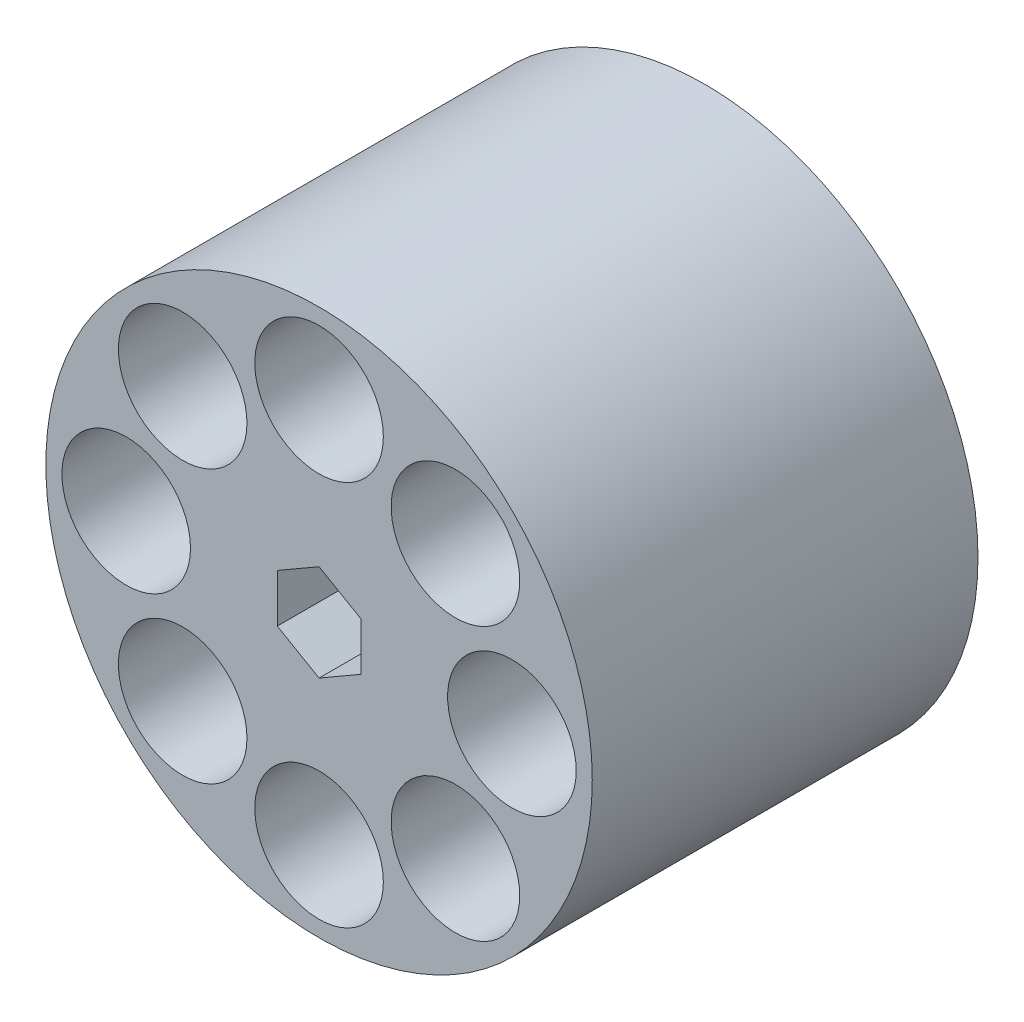
ISO-10303-21;
HEADER;
FILE_DESCRIPTION(('STEP AP214'),'2;1');
FILE_NAME('part.step','',(''),(''),'','','');
FILE_SCHEMA(('AUTOMOTIVE_DESIGN { 1 0 10303 214 1 1 1 1 }'));
ENDSEC;
DATA;
#1=APPLICATION_CONTEXT('core data for automotive mechanical design processes');
#2=APPLICATION_PROTOCOL_DEFINITION('international standard','automotive_design',2000,#1);
#3=PRODUCT_CONTEXT('',#1,'mechanical');
#4=PRODUCT('Part','Part','',(#3));
#5=PRODUCT_RELATED_PRODUCT_CATEGORY('part','',(#4));
#6=PRODUCT_DEFINITION_FORMATION('','',#4);
#7=PRODUCT_DEFINITION_CONTEXT('part definition',#1,'design');
#8=PRODUCT_DEFINITION('design','',#6,#7);
#9=PRODUCT_DEFINITION_SHAPE('','',#8);
#10=(LENGTH_UNIT() NAMED_UNIT(*) SI_UNIT(.MILLI.,.METRE.));
#11=(NAMED_UNIT(*) PLANE_ANGLE_UNIT() SI_UNIT($,.RADIAN.));
#12=(NAMED_UNIT(*) SI_UNIT($,.STERADIAN.) SOLID_ANGLE_UNIT());
#13=UNCERTAINTY_MEASURE_WITH_UNIT(LENGTH_MEASURE(1.E-05),#10,'distance_accuracy_value','');
#14=(GEOMETRIC_REPRESENTATION_CONTEXT(3) GLOBAL_UNCERTAINTY_ASSIGNED_CONTEXT((#13)) GLOBAL_UNIT_ASSIGNED_CONTEXT((#10,
#11,#12)) REPRESENTATION_CONTEXT('',''));
#15=CARTESIAN_POINT('',(0.,0.,0.));
#16=DIRECTION('',(0.,0.,1.));
#17=DIRECTION('',(1.,0.,0.));
#18=AXIS2_PLACEMENT_3D('',#15,#16,#17);
#19=CARTESIAN_POINT('',(0.,6.,-8.));
#20=DIRECTION('',(0.,0.,1.));
#21=DIRECTION('',(1.,0.,0.));
#22=AXIS2_PLACEMENT_3D('',#19,#20,#21);
#23=CYLINDRICAL_SURFACE('',#22,1.);
#24=CARTESIAN_POINT('',(0.,6.,0.));
#25=DIRECTION('',(0.,0.,1.));
#26=DIRECTION('',(1.,0.,0.));
#27=AXIS2_PLACEMENT_3D('',#24,#25,#26);
#28=CIRCLE('',#27,1.);
#29=CARTESIAN_POINT('',(1.,6.,0.));
#30=VERTEX_POINT('',#29);
#31=EDGE_CURVE('E144',#30,#30,#28,.T.);
#32=ORIENTED_EDGE('',*,*,#31,.F.);
#33=EDGE_LOOP('',(#32));
#34=FACE_BOUND('',#33,.T.);
#35=CARTESIAN_POINT('',(0.,6.,8.));
#36=DIRECTION('',(0.,0.,1.));
#37=DIRECTION('',(1.,0.,0.));
#38=AXIS2_PLACEMENT_3D('',#35,#36,#37);
#39=CIRCLE('',#38,1.);
#40=CARTESIAN_POINT('',(1.,6.,8.));
#41=VERTEX_POINT('',#40);
#42=EDGE_CURVE('E43',#41,#41,#39,.F.);
#43=ORIENTED_EDGE('',*,*,#42,.F.);
#44=EDGE_LOOP('',(#43));
#45=FACE_BOUND('',#44,.T.);
#46=ADVANCED_FACE('F39',(#34,#45),#23,.F.);
#47=CARTESIAN_POINT('',(4.24264068711929,4.24264068711928,-8.));
#48=DIRECTION('',(0.,0.,1.));
#49=DIRECTION('',(1.,0.,0.));
#50=AXIS2_PLACEMENT_3D('',#47,#48,#49);
#51=CYLINDRICAL_SURFACE('',#50,1.);
#52=CARTESIAN_POINT('',(4.24264068711929,4.24264068711928,0.));
#53=DIRECTION('',(0.,0.,1.));
#54=DIRECTION('',(1.,0.,0.));
#55=AXIS2_PLACEMENT_3D('',#52,#53,#54);
#56=CIRCLE('',#55,1.);
#57=CARTESIAN_POINT('',(5.24264068711929,4.24264068711928,0.));
#58=VERTEX_POINT('',#57);
#59=EDGE_CURVE('E155',#58,#58,#56,.T.);
#60=ORIENTED_EDGE('',*,*,#59,.F.);
#61=EDGE_LOOP('',(#60));
#62=FACE_BOUND('',#61,.T.);
#63=CARTESIAN_POINT('',(4.24264068711929,4.24264068711928,8.));
#64=DIRECTION('',(0.,0.,1.));
#65=DIRECTION('',(1.,0.,0.));
#66=AXIS2_PLACEMENT_3D('',#63,#64,#65);
#67=CIRCLE('',#66,1.);
#68=CARTESIAN_POINT('',(5.24264068711929,4.24264068711928,8.));
#69=VERTEX_POINT('',#68);
#70=EDGE_CURVE('E193',#69,#69,#67,.F.);
#71=ORIENTED_EDGE('',*,*,#70,.F.);
#72=EDGE_LOOP('',(#71));
#73=FACE_BOUND('',#72,.T.);
#74=ADVANCED_FACE('F232',(#62,#73),#51,.F.);
#75=CARTESIAN_POINT('',(6.,0.,-8.));
#76=DIRECTION('',(0.,0.,1.));
#77=DIRECTION('',(1.,0.,0.));
#78=AXIS2_PLACEMENT_3D('',#75,#76,#77);
#79=CYLINDRICAL_SURFACE('',#78,1.);
#80=CARTESIAN_POINT('',(6.,0.,0.));
#81=DIRECTION('',(0.,0.,1.));
#82=DIRECTION('',(1.,0.,0.));
#83=AXIS2_PLACEMENT_3D('',#80,#81,#82);
#84=CIRCLE('',#83,1.);
#85=CARTESIAN_POINT('',(7.,0.,0.));
#86=VERTEX_POINT('',#85);
#87=EDGE_CURVE('E158',#86,#86,#84,.T.);
#88=ORIENTED_EDGE('',*,*,#87,.F.);
#89=EDGE_LOOP('',(#88));
#90=FACE_BOUND('',#89,.T.);
#91=CARTESIAN_POINT('',(6.,0.,8.));
#92=DIRECTION('',(0.,0.,1.));
#93=DIRECTION('',(1.,0.,0.));
#94=AXIS2_PLACEMENT_3D('',#91,#92,#93);
#95=CIRCLE('',#94,1.);
#96=CARTESIAN_POINT('',(7.,0.,8.));
#97=VERTEX_POINT('',#96);
#98=EDGE_CURVE('E191',#97,#97,#95,.F.);
#99=ORIENTED_EDGE('',*,*,#98,.F.);
#100=EDGE_LOOP('',(#99));
#101=FACE_BOUND('',#100,.T.);
#102=ADVANCED_FACE('F238',(#90,#101),#79,.F.);
#103=CARTESIAN_POINT('',(4.24264068711926,-4.24264068711931,-8.));
#104=DIRECTION('',(0.,0.,1.));
#105=DIRECTION('',(1.,0.,0.));
#106=AXIS2_PLACEMENT_3D('',#103,#104,#105);
#107=CYLINDRICAL_SURFACE('',#106,1.);
#108=CARTESIAN_POINT('',(4.24264068711926,-4.24264068711931,0.));
#109=DIRECTION('',(0.,0.,1.));
#110=DIRECTION('',(1.,0.,0.));
#111=AXIS2_PLACEMENT_3D('',#108,#109,#110);
#112=CIRCLE('',#111,1.);
#113=CARTESIAN_POINT('',(5.24264068711926,-4.24264068711931,0.));
#114=VERTEX_POINT('',#113);
#115=EDGE_CURVE('E161',#114,#114,#112,.T.);
#116=ORIENTED_EDGE('',*,*,#115,.F.);
#117=EDGE_LOOP('',(#116));
#118=FACE_BOUND('',#117,.T.);
#119=CARTESIAN_POINT('',(4.24264068711926,-4.24264068711931,8.));
#120=DIRECTION('',(0.,0.,1.));
#121=DIRECTION('',(1.,0.,0.));
#122=AXIS2_PLACEMENT_3D('',#119,#120,#121);
#123=CIRCLE('',#122,1.);
#124=CARTESIAN_POINT('',(5.24264068711926,-4.24264068711931,8.));
#125=VERTEX_POINT('',#124);
#126=EDGE_CURVE('E188',#125,#125,#123,.F.);
#127=ORIENTED_EDGE('',*,*,#126,.F.);
#128=EDGE_LOOP('',(#127));
#129=FACE_BOUND('',#128,.T.);
#130=ADVANCED_FACE('F330',(#118,#129),#107,.F.);
#131=CARTESIAN_POINT('',(0.,-6.,-8.));
#132=DIRECTION('',(0.,0.,1.));
#133=DIRECTION('',(1.,0.,0.));
#134=AXIS2_PLACEMENT_3D('',#131,#132,#133);
#135=CYLINDRICAL_SURFACE('',#134,1.);
#136=CARTESIAN_POINT('',(0.,-6.,0.));
#137=DIRECTION('',(0.,0.,1.));
#138=DIRECTION('',(1.,0.,0.));
#139=AXIS2_PLACEMENT_3D('',#136,#137,#138);
#140=CIRCLE('',#139,1.);
#141=CARTESIAN_POINT('',(0.999999999999958,-6.,0.));
#142=VERTEX_POINT('',#141);
#143=EDGE_CURVE('E164',#142,#142,#140,.T.);
#144=ORIENTED_EDGE('',*,*,#143,.F.);
#145=EDGE_LOOP('',(#144));
#146=FACE_BOUND('',#145,.T.);
#147=CARTESIAN_POINT('',(0.,-6.,8.));
#148=DIRECTION('',(0.,0.,1.));
#149=DIRECTION('',(1.,0.,0.));
#150=AXIS2_PLACEMENT_3D('',#147,#148,#149);
#151=CIRCLE('',#150,1.);
#152=CARTESIAN_POINT('',(0.999999999999958,-6.,8.));
#153=VERTEX_POINT('',#152);
#154=EDGE_CURVE('E185',#153,#153,#151,.F.);
#155=ORIENTED_EDGE('',*,*,#154,.F.);
#156=EDGE_LOOP('',(#155));
#157=FACE_BOUND('',#156,.T.);
#158=ADVANCED_FACE('F334',(#146,#157),#135,.F.);
#159=CARTESIAN_POINT('',(-4.24264068711932,-4.24264068711925,-8.));
#160=DIRECTION('',(0.,0.,1.));
#161=DIRECTION('',(1.,0.,0.));
#162=AXIS2_PLACEMENT_3D('',#159,#160,#161);
#163=CYLINDRICAL_SURFACE('',#162,1.);
#164=CARTESIAN_POINT('',(-4.24264068711932,-4.24264068711925,0.));
#165=DIRECTION('',(0.,0.,1.));
#166=DIRECTION('',(1.,0.,0.));
#167=AXIS2_PLACEMENT_3D('',#164,#165,#166);
#168=CIRCLE('',#167,1.);
#169=CARTESIAN_POINT('',(-3.24264068711932,-4.24264068711925,0.));
#170=VERTEX_POINT('',#169);
#171=EDGE_CURVE('E167',#170,#170,#168,.T.);
#172=ORIENTED_EDGE('',*,*,#171,.F.);
#173=EDGE_LOOP('',(#172));
#174=FACE_BOUND('',#173,.T.);
#175=CARTESIAN_POINT('',(-4.24264068711932,-4.24264068711925,8.));
#176=DIRECTION('',(0.,0.,1.));
#177=DIRECTION('',(1.,0.,0.));
#178=AXIS2_PLACEMENT_3D('',#175,#176,#177);
#179=CIRCLE('',#178,1.);
#180=CARTESIAN_POINT('',(-3.24264068711932,-4.24264068711925,8.));
#181=VERTEX_POINT('',#180);
#182=EDGE_CURVE('E182',#181,#181,#179,.F.);
#183=ORIENTED_EDGE('',*,*,#182,.F.);
#184=EDGE_LOOP('',(#183));
#185=FACE_BOUND('',#184,.T.);
#186=ADVANCED_FACE('F282',(#174,#185),#163,.F.);
#187=CARTESIAN_POINT('',(-6.,0.,-8.));
#188=DIRECTION('',(0.,0.,1.));
#189=DIRECTION('',(1.,0.,0.));
#190=AXIS2_PLACEMENT_3D('',#187,#188,#189);
#191=CYLINDRICAL_SURFACE('',#190,1.);
#192=CARTESIAN_POINT('',(-6.,0.,0.));
#193=DIRECTION('',(0.,0.,1.));
#194=DIRECTION('',(1.,0.,0.));
#195=AXIS2_PLACEMENT_3D('',#192,#193,#194);
#196=CIRCLE('',#195,1.);
#197=CARTESIAN_POINT('',(-5.,0.,0.));
#198=VERTEX_POINT('',#197);
#199=EDGE_CURVE('E170',#198,#198,#196,.T.);
#200=ORIENTED_EDGE('',*,*,#199,.F.);
#201=EDGE_LOOP('',(#200));
#202=FACE_BOUND('',#201,.T.);
#203=CARTESIAN_POINT('',(-6.,0.,8.));
#204=DIRECTION('',(0.,0.,1.));
#205=DIRECTION('',(1.,0.,0.));
#206=AXIS2_PLACEMENT_3D('',#203,#204,#205);
#207=CIRCLE('',#206,1.);
#208=CARTESIAN_POINT('',(-5.,0.,8.));
#209=VERTEX_POINT('',#208);
#210=EDGE_CURVE('E178',#209,#209,#207,.F.);
#211=ORIENTED_EDGE('',*,*,#210,.F.);
#212=EDGE_LOOP('',(#211));
#213=FACE_BOUND('',#212,.T.);
#214=ADVANCED_FACE('F276',(#202,#213),#191,.F.);
#215=CARTESIAN_POINT('',(-4.24264068711924,4.24264068711934,-8.));
#216=DIRECTION('',(0.,0.,1.));
#217=DIRECTION('',(1.,0.,0.));
#218=AXIS2_PLACEMENT_3D('',#215,#216,#217);
#219=CYLINDRICAL_SURFACE('',#218,1.);
#220=CARTESIAN_POINT('',(-4.24264068711924,4.24264068711934,0.));
#221=DIRECTION('',(0.,0.,1.));
#222=DIRECTION('',(1.,0.,0.));
#223=AXIS2_PLACEMENT_3D('',#220,#221,#222);
#224=CIRCLE('',#223,1.);
#225=CARTESIAN_POINT('',(-3.24264068711924,4.24264068711934,0.));
#226=VERTEX_POINT('',#225);
#227=EDGE_CURVE('E152',#226,#226,#224,.T.);
#228=ORIENTED_EDGE('',*,*,#227,.F.);
#229=EDGE_LOOP('',(#228));
#230=FACE_BOUND('',#229,.T.);
#231=CARTESIAN_POINT('',(-4.24264068711924,4.24264068711934,8.));
#232=DIRECTION('',(0.,0.,1.));
#233=DIRECTION('',(1.,0.,0.));
#234=AXIS2_PLACEMENT_3D('',#231,#232,#233);
#235=CIRCLE('',#234,1.);
#236=CARTESIAN_POINT('',(-3.24264068711924,4.24264068711934,8.));
#237=VERTEX_POINT('',#236);
#238=EDGE_CURVE('E175',#237,#237,#235,.F.);
#239=ORIENTED_EDGE('',*,*,#238,.F.);
#240=EDGE_LOOP('',(#239));
#241=FACE_BOUND('',#240,.T.);
#242=ADVANCED_FACE('F245',(#230,#241),#219,.F.);
#243=CARTESIAN_POINT('',(0.,0.,12.));
#244=DIRECTION('',(0.,0.,-1.));
#245=DIRECTION('',(-1.,0.,0.));
#246=AXIS2_PLACEMENT_3D('',#243,#244,#245);
#247=CYLINDRICAL_SURFACE('',#246,8.5);
#248=CARTESIAN_POINT('',(0.,0.,12.));
#249=DIRECTION('',(0.,0.,1.));
#250=DIRECTION('',(1.,0.,0.));
#251=AXIS2_PLACEMENT_3D('',#248,#249,#250);
#252=CIRCLE('',#251,8.5);
#253=CARTESIAN_POINT('',(8.5,0.,12.));
#254=VERTEX_POINT('',#253);
#255=EDGE_CURVE('E11',#254,#254,#252,.T.);
#256=ORIENTED_EDGE('',*,*,#255,.F.);
#257=EDGE_LOOP('',(#256));
#258=FACE_BOUND('',#257,.T.);
#259=CARTESIAN_POINT('',(0.,0.,0.));
#260=DIRECTION('',(0.,0.,1.));
#261=DIRECTION('',(1.,0.,0.));
#262=AXIS2_PLACEMENT_3D('',#259,#260,#261);
#263=CIRCLE('',#262,8.5);
#264=CARTESIAN_POINT('',(8.5,0.,0.));
#265=VERTEX_POINT('',#264);
#266=EDGE_CURVE('E48',#265,#265,#263,.T.);
#267=ORIENTED_EDGE('',*,*,#266,.T.);
#268=EDGE_LOOP('',(#267));
#269=FACE_BOUND('',#268,.T.);
#270=ADVANCED_FACE('F41',(#258,#269),#247,.T.);
#271=CARTESIAN_POINT('',(0.,0.,12.));
#272=DIRECTION('',(0.,0.,1.));
#273=DIRECTION('',(1.,0.,0.));
#274=AXIS2_PLACEMENT_3D('',#271,#272,#273);
#275=PLANE('',#274);
#276=CARTESIAN_POINT('',(-4.24264068711929,4.24264068711928,12.));
#277=DIRECTION('',(0.,0.,1.));
#278=DIRECTION('',(1.,0.,0.));
#279=AXIS2_PLACEMENT_3D('',#276,#277,#278);
#280=CIRCLE('',#279,2.);
#281=CARTESIAN_POINT('',(-2.24264068711929,4.24264068711928,12.));
#282=VERTEX_POINT('',#281);
#283=EDGE_CURVE('E374',#282,#282,#280,.T.);
#284=ORIENTED_EDGE('',*,*,#283,.F.);
#285=EDGE_LOOP('',(#284));
#286=FACE_BOUND('',#285,.T.);
#287=CARTESIAN_POINT('',(-6.,0.,12.));
#288=DIRECTION('',(0.,0.,1.));
#289=DIRECTION('',(1.,0.,0.));
#290=AXIS2_PLACEMENT_3D('',#287,#288,#289);
#291=CIRCLE('',#290,2.);
#292=CARTESIAN_POINT('',(-4.,0.,12.));
#293=VERTEX_POINT('',#292);
#294=EDGE_CURVE('E373',#293,#293,#291,.T.);
#295=ORIENTED_EDGE('',*,*,#294,.F.);
#296=EDGE_LOOP('',(#295));
#297=FACE_BOUND('',#296,.T.);
#298=CARTESIAN_POINT('',(-4.24264068711929,-4.24264068711929,12.));
#299=DIRECTION('',(0.,0.,1.));
#300=DIRECTION('',(1.,0.,0.));
#301=AXIS2_PLACEMENT_3D('',#298,#299,#300);
#302=CIRCLE('',#301,2.);
#303=CARTESIAN_POINT('',(-2.24264068711929,-4.24264068711929,12.));
#304=VERTEX_POINT('',#303);
#305=EDGE_CURVE('E417',#304,#304,#302,.T.);
#306=ORIENTED_EDGE('',*,*,#305,.F.);
#307=EDGE_LOOP('',(#306));
#308=FACE_BOUND('',#307,.T.);
#309=CARTESIAN_POINT('',(0.,-6.,12.));
#310=DIRECTION('',(0.,0.,1.));
#311=DIRECTION('',(1.,0.,0.));
#312=AXIS2_PLACEMENT_3D('',#309,#310,#311);
#313=CIRCLE('',#312,2.);
#314=CARTESIAN_POINT('',(2.,-6.,12.));
#315=VERTEX_POINT('',#314);
#316=EDGE_CURVE('E411',#315,#315,#313,.T.);
#317=ORIENTED_EDGE('',*,*,#316,.F.);
#318=EDGE_LOOP('',(#317));
#319=FACE_BOUND('',#318,.T.);
#320=CARTESIAN_POINT('',(4.24264068711929,-4.24264068711929,12.));
#321=DIRECTION('',(0.,0.,1.));
#322=DIRECTION('',(1.,0.,0.));
#323=AXIS2_PLACEMENT_3D('',#320,#321,#322);
#324=CIRCLE('',#323,2.);
#325=CARTESIAN_POINT('',(6.24264068711929,-4.24264068711929,12.));
#326=VERTEX_POINT('',#325);
#327=EDGE_CURVE('E405',#326,#326,#324,.T.);
#328=ORIENTED_EDGE('',*,*,#327,.F.);
#329=EDGE_LOOP('',(#328));
#330=FACE_BOUND('',#329,.T.);
#331=CARTESIAN_POINT('',(6.,0.,12.));
#332=DIRECTION('',(0.,0.,1.));
#333=DIRECTION('',(1.,0.,0.));
#334=AXIS2_PLACEMENT_3D('',#331,#332,#333);
#335=CIRCLE('',#334,2.);
#336=CARTESIAN_POINT('',(8.,0.,12.));
#337=VERTEX_POINT('',#336);
#338=EDGE_CURVE('E397',#337,#337,#335,.T.);
#339=ORIENTED_EDGE('',*,*,#338,.F.);
#340=EDGE_LOOP('',(#339));
#341=FACE_BOUND('',#340,.T.);
#342=CARTESIAN_POINT('',(4.24264068711929,4.24264068711929,12.));
#343=DIRECTION('',(0.,0.,1.));
#344=DIRECTION('',(1.,0.,0.));
#345=AXIS2_PLACEMENT_3D('',#342,#343,#344);
#346=CIRCLE('',#345,2.);
#347=CARTESIAN_POINT('',(6.24264068711929,4.24264068711929,12.));
#348=VERTEX_POINT('',#347);
#349=EDGE_CURVE('E388',#348,#348,#346,.T.);
#350=ORIENTED_EDGE('',*,*,#349,.F.);
#351=EDGE_LOOP('',(#350));
#352=FACE_BOUND('',#351,.T.);
#353=CARTESIAN_POINT('',(0.,6.,12.));
#354=DIRECTION('',(0.,0.,1.));
#355=DIRECTION('',(1.,0.,0.));
#356=AXIS2_PLACEMENT_3D('',#353,#354,#355);
#357=CIRCLE('',#356,2.);
#358=CARTESIAN_POINT('',(2.,6.,12.));
#359=VERTEX_POINT('',#358);
#360=EDGE_CURVE('E386',#359,#359,#357,.T.);
#361=ORIENTED_EDGE('',*,*,#360,.F.);
#362=EDGE_LOOP('',(#361));
#363=FACE_BOUND('',#362,.T.);
#364=DIRECTION('',(-0.866025403784439,0.5,0.));
#365=VECTOR('',#364,1.);
#366=CARTESIAN_POINT('',(1.29903810567666,0.75,12.));
#367=LINE('',#366,#365);
#368=CARTESIAN_POINT('',(1.29903810567666,0.75,12.));
#369=VERTEX_POINT('',#368);
#370=CARTESIAN_POINT('',(0.,1.5,12.));
#371=VERTEX_POINT('',#370);
#372=EDGE_CURVE('E56',#369,#371,#367,.T.);
#373=ORIENTED_EDGE('',*,*,#372,.F.);
#374=DIRECTION('',(0.,1.,0.));
#375=VECTOR('',#374,1.);
#376=CARTESIAN_POINT('',(1.29903810567666,-0.75,12.));
#377=LINE('',#376,#375);
#378=CARTESIAN_POINT('',(1.29903810567666,-0.75,12.));
#379=VERTEX_POINT('',#378);
#380=EDGE_CURVE('E140',#379,#369,#377,.T.);
#381=ORIENTED_EDGE('',*,*,#380,.F.);
#382=DIRECTION('',(0.866025403784439,0.5,0.));
#383=VECTOR('',#382,1.);
#384=CARTESIAN_POINT('',(0.,-1.5,12.));
#385=LINE('',#384,#383);
#386=CARTESIAN_POINT('',(0.,-1.5,12.));
#387=VERTEX_POINT('',#386);
#388=EDGE_CURVE('E138',#387,#379,#385,.T.);
#389=ORIENTED_EDGE('',*,*,#388,.F.);
#390=DIRECTION('',(0.866025403784438,-0.5,0.));
#391=VECTOR('',#390,1.);
#392=CARTESIAN_POINT('',(-1.29903810567666,-0.749999999999999,12.));
#393=LINE('',#392,#391);
#394=CARTESIAN_POINT('',(-1.29903810567666,-0.749999999999999,12.));
#395=VERTEX_POINT('',#394);
#396=EDGE_CURVE('E104',#395,#387,#393,.T.);
#397=ORIENTED_EDGE('',*,*,#396,.F.);
#398=DIRECTION('',(0.,-1.,0.));
#399=VECTOR('',#398,1.);
#400=CARTESIAN_POINT('',(-1.29903810567666,0.75,12.));
#401=LINE('',#400,#399);
#402=CARTESIAN_POINT('',(-1.29903810567666,0.75,12.));
#403=VERTEX_POINT('',#402);
#404=EDGE_CURVE('E134',#403,#395,#401,.T.);
#405=ORIENTED_EDGE('',*,*,#404,.F.);
#406=DIRECTION('',(-0.866025403784439,-0.5,0.));
#407=VECTOR('',#406,1.);
#408=CARTESIAN_POINT('',(0.,1.5,12.));
#409=LINE('',#408,#407);
#410=EDGE_CURVE('E130',#371,#403,#409,.T.);
#411=ORIENTED_EDGE('',*,*,#410,.F.);
#412=EDGE_LOOP('',(#373,#381,#389,#397,#405,#411));
#413=FACE_BOUND('',#412,.T.);
#414=ORIENTED_EDGE('',*,*,#255,.T.);
#415=EDGE_LOOP('',(#414));
#416=FACE_BOUND('',#415,.T.);
#417=ADVANCED_FACE('F216',(#286,#297,#308,#319,#330,#341,#352,#363,#413,#416),#275,.T.);
#418=CARTESIAN_POINT('',(0.,0.,0.));
#419=DIRECTION('',(0.,0.,1.));
#420=DIRECTION('',(1.,0.,0.));
#421=AXIS2_PLACEMENT_3D('',#418,#419,#420);
#422=PLANE('',#421);
#423=CARTESIAN_POINT('',(0.,0.,0.));
#424=DIRECTION('',(0.,0.,-1.));
#425=DIRECTION('',(-1.,0.,0.));
#426=AXIS2_PLACEMENT_3D('',#423,#424,#425);
#427=CIRCLE('',#426,4.4);
#428=CARTESIAN_POINT('',(-4.4,0.,0.));
#429=VERTEX_POINT('',#428);
#430=EDGE_CURVE('E198',#429,#429,#427,.T.);
#431=ORIENTED_EDGE('',*,*,#430,.F.);
#432=EDGE_LOOP('',(#431));
#433=FACE_BOUND('',#432,.T.);
#434=ORIENTED_EDGE('',*,*,#227,.T.);
#435=EDGE_LOOP('',(#434));
#436=FACE_BOUND('',#435,.T.);
#437=ORIENTED_EDGE('',*,*,#199,.T.);
#438=EDGE_LOOP('',(#437));
#439=FACE_BOUND('',#438,.T.);
#440=ORIENTED_EDGE('',*,*,#171,.T.);
#441=EDGE_LOOP('',(#440));
#442=FACE_BOUND('',#441,.T.);
#443=ORIENTED_EDGE('',*,*,#143,.T.);
#444=EDGE_LOOP('',(#443));
#445=FACE_BOUND('',#444,.T.);
#446=ORIENTED_EDGE('',*,*,#115,.T.);
#447=EDGE_LOOP('',(#446));
#448=FACE_BOUND('',#447,.T.);
#449=ORIENTED_EDGE('',*,*,#87,.T.);
#450=EDGE_LOOP('',(#449));
#451=FACE_BOUND('',#450,.T.);
#452=ORIENTED_EDGE('',*,*,#59,.T.);
#453=EDGE_LOOP('',(#452));
#454=FACE_BOUND('',#453,.T.);
#455=ORIENTED_EDGE('',*,*,#31,.T.);
#456=EDGE_LOOP('',(#455));
#457=FACE_BOUND('',#456,.T.);
#458=ORIENTED_EDGE('',*,*,#266,.F.);
#459=EDGE_LOOP('',(#458));
#460=FACE_BOUND('',#459,.T.);
#461=ADVANCED_FACE('F228',(#433,#436,#439,#442,#445,#448,#451,#454,#457,#460),#422,.F.);
#462=CARTESIAN_POINT('',(1.29903810567666,0.75,4.));
#463=DIRECTION('',(0.5,0.866025403784439,0.));
#464=DIRECTION('',(-0.866025403784439,0.5,0.));
#465=AXIS2_PLACEMENT_3D('',#462,#463,#464);
#466=PLANE('',#465);
#467=ORIENTED_EDGE('',*,*,#372,.T.);
#468=DIRECTION('',(0.,0.,1.));
#469=VECTOR('',#468,1.);
#470=CARTESIAN_POINT('',(0.,1.5,4.));
#471=LINE('',#470,#469);
#472=CARTESIAN_POINT('',(0.,1.5,4.));
#473=VERTEX_POINT('',#472);
#474=EDGE_CURVE('E86',#473,#371,#471,.T.);
#475=ORIENTED_EDGE('',*,*,#474,.F.);
#476=DIRECTION('',(-0.866025403784439,0.5,0.));
#477=VECTOR('',#476,1.);
#478=CARTESIAN_POINT('',(1.29903810567666,0.75,4.));
#479=LINE('',#478,#477);
#480=CARTESIAN_POINT('',(1.29903810567666,0.75,4.));
#481=VERTEX_POINT('',#480);
#482=EDGE_CURVE('E142',#481,#473,#479,.T.);
#483=ORIENTED_EDGE('',*,*,#482,.F.);
#484=DIRECTION('',(0.,0.,1.));
#485=VECTOR('',#484,1.);
#486=CARTESIAN_POINT('',(1.29903810567666,0.75,4.));
#487=LINE('',#486,#485);
#488=EDGE_CURVE('E64',#481,#369,#487,.T.);
#489=ORIENTED_EDGE('',*,*,#488,.T.);
#490=EDGE_LOOP('',(#467,#475,#483,#489));
#491=FACE_BOUND('',#490,.T.);
#492=ADVANCED_FACE('F221',(#491),#466,.F.);
#493=CARTESIAN_POINT('',(1.29903810567666,-0.75,4.));
#494=DIRECTION('',(1.,0.,0.));
#495=DIRECTION('',(0.,1.,0.));
#496=AXIS2_PLACEMENT_3D('',#493,#494,#495);
#497=PLANE('',#496);
#498=ORIENTED_EDGE('',*,*,#380,.T.);
#499=ORIENTED_EDGE('',*,*,#488,.F.);
#500=DIRECTION('',(0.,1.,0.));
#501=VECTOR('',#500,1.);
#502=CARTESIAN_POINT('',(1.29903810567666,-0.75,4.));
#503=LINE('',#502,#501);
#504=CARTESIAN_POINT('',(1.29903810567666,-0.75,4.));
#505=VERTEX_POINT('',#504);
#506=EDGE_CURVE('E116',#505,#481,#503,.T.);
#507=ORIENTED_EDGE('',*,*,#506,.F.);
#508=DIRECTION('',(0.,0.,1.));
#509=VECTOR('',#508,1.);
#510=CARTESIAN_POINT('',(1.29903810567666,-0.75,4.));
#511=LINE('',#510,#509);
#512=EDGE_CURVE('E108',#505,#379,#511,.T.);
#513=ORIENTED_EDGE('',*,*,#512,.T.);
#514=EDGE_LOOP('',(#498,#499,#507,#513));
#515=FACE_BOUND('',#514,.T.);
#516=ADVANCED_FACE('F219',(#515),#497,.F.);
#517=CARTESIAN_POINT('',(0.,-1.5,4.));
#518=DIRECTION('',(0.5,-0.866025403784439,0.));
#519=DIRECTION('',(0.866025403784439,0.5,0.));
#520=AXIS2_PLACEMENT_3D('',#517,#518,#519);
#521=PLANE('',#520);
#522=ORIENTED_EDGE('',*,*,#388,.T.);
#523=ORIENTED_EDGE('',*,*,#512,.F.);
#524=DIRECTION('',(0.866025403784439,0.5,0.));
#525=VECTOR('',#524,1.);
#526=CARTESIAN_POINT('',(0.,-1.5,4.));
#527=LINE('',#526,#525);
#528=CARTESIAN_POINT('',(0.,-1.5,4.));
#529=VERTEX_POINT('',#528);
#530=EDGE_CURVE('E112',#529,#505,#527,.T.);
#531=ORIENTED_EDGE('',*,*,#530,.F.);
#532=DIRECTION('',(0.,0.,1.));
#533=VECTOR('',#532,1.);
#534=CARTESIAN_POINT('',(0.,-1.5,4.));
#535=LINE('',#534,#533);
#536=EDGE_CURVE('E97',#529,#387,#535,.T.);
#537=ORIENTED_EDGE('',*,*,#536,.T.);
#538=EDGE_LOOP('',(#522,#523,#531,#537));
#539=FACE_BOUND('',#538,.T.);
#540=ADVANCED_FACE('F113',(#539),#521,.F.);
#541=CARTESIAN_POINT('',(-1.29903810567666,-0.749999999999999,4.));
#542=DIRECTION('',(-0.5,-0.866025403784438,0.));
#543=DIRECTION('',(0.866025403784439,-0.5,0.));
#544=AXIS2_PLACEMENT_3D('',#541,#542,#543);
#545=PLANE('',#544);
#546=ORIENTED_EDGE('',*,*,#396,.T.);
#547=ORIENTED_EDGE('',*,*,#536,.F.);
#548=DIRECTION('',(0.866025403784438,-0.5,0.));
#549=VECTOR('',#548,1.);
#550=CARTESIAN_POINT('',(-1.29903810567666,-0.749999999999999,4.));
#551=LINE('',#550,#549);
#552=CARTESIAN_POINT('',(-1.29903810567666,-0.749999999999999,4.));
#553=VERTEX_POINT('',#552);
#554=EDGE_CURVE('E101',#553,#529,#551,.T.);
#555=ORIENTED_EDGE('',*,*,#554,.F.);
#556=DIRECTION('',(0.,0.,1.));
#557=VECTOR('',#556,1.);
#558=CARTESIAN_POINT('',(-1.29903810567666,-0.749999999999999,4.));
#559=LINE('',#558,#557);
#560=EDGE_CURVE('E109',#553,#395,#559,.T.);
#561=ORIENTED_EDGE('',*,*,#560,.T.);
#562=EDGE_LOOP('',(#546,#547,#555,#561));
#563=FACE_BOUND('',#562,.T.);
#564=ADVANCED_FACE('F99',(#563),#545,.F.);
#565=CARTESIAN_POINT('',(-1.29903810567666,0.75,4.));
#566=DIRECTION('',(-1.,0.,0.));
#567=DIRECTION('',(0.,-1.,0.));
#568=AXIS2_PLACEMENT_3D('',#565,#566,#567);
#569=PLANE('',#568);
#570=ORIENTED_EDGE('',*,*,#404,.T.);
#571=ORIENTED_EDGE('',*,*,#560,.F.);
#572=DIRECTION('',(0.,-1.,0.));
#573=VECTOR('',#572,1.);
#574=CARTESIAN_POINT('',(-1.29903810567666,0.75,4.));
#575=LINE('',#574,#573);
#576=CARTESIAN_POINT('',(-1.29903810567666,0.75,4.));
#577=VERTEX_POINT('',#576);
#578=EDGE_CURVE('E122',#577,#553,#575,.T.);
#579=ORIENTED_EDGE('',*,*,#578,.F.);
#580=DIRECTION('',(0.,0.,1.));
#581=VECTOR('',#580,1.);
#582=CARTESIAN_POINT('',(-1.29903810567666,0.75,4.));
#583=LINE('',#582,#581);
#584=EDGE_CURVE('E147',#577,#403,#583,.T.);
#585=ORIENTED_EDGE('',*,*,#584,.T.);
#586=EDGE_LOOP('',(#570,#571,#579,#585));
#587=FACE_BOUND('',#586,.T.);
#588=ADVANCED_FACE('F214',(#587),#569,.F.);
#589=CARTESIAN_POINT('',(0.,1.5,4.));
#590=DIRECTION('',(-0.5,0.866025403784439,0.));
#591=DIRECTION('',(-0.866025403784439,-0.5,0.));
#592=AXIS2_PLACEMENT_3D('',#589,#590,#591);
#593=PLANE('',#592);
#594=ORIENTED_EDGE('',*,*,#410,.T.);
#595=ORIENTED_EDGE('',*,*,#584,.F.);
#596=DIRECTION('',(-0.866025403784439,-0.5,0.));
#597=VECTOR('',#596,1.);
#598=CARTESIAN_POINT('',(0.,1.5,4.));
#599=LINE('',#598,#597);
#600=EDGE_CURVE('E124',#473,#577,#599,.T.);
#601=ORIENTED_EDGE('',*,*,#600,.F.);
#602=ORIENTED_EDGE('',*,*,#474,.T.);
#603=EDGE_LOOP('',(#594,#595,#601,#602));
#604=FACE_BOUND('',#603,.T.);
#605=ADVANCED_FACE('F210',(#604),#593,.F.);
#606=CARTESIAN_POINT('',(0.,0.,4.));
#607=DIRECTION('',(0.,0.,1.));
#608=DIRECTION('',(1.,0.,0.));
#609=AXIS2_PLACEMENT_3D('',#606,#607,#608);
#610=PLANE('',#609);
#611=ORIENTED_EDGE('',*,*,#482,.T.);
#612=ORIENTED_EDGE('',*,*,#600,.T.);
#613=ORIENTED_EDGE('',*,*,#578,.T.);
#614=ORIENTED_EDGE('',*,*,#554,.T.);
#615=ORIENTED_EDGE('',*,*,#530,.T.);
#616=ORIENTED_EDGE('',*,*,#506,.T.);
#617=EDGE_LOOP('',(#611,#612,#613,#614,#615,#616));
#618=FACE_BOUND('',#617,.T.);
#619=ADVANCED_FACE('F119',(#618),#610,.T.);
#620=CARTESIAN_POINT('',(0.,0.,2.));
#621=DIRECTION('',(0.,0.,-1.));
#622=DIRECTION('',(-1.,0.,0.));
#623=AXIS2_PLACEMENT_3D('',#620,#621,#622);
#624=CYLINDRICAL_SURFACE('',#623,4.4);
#625=CARTESIAN_POINT('',(0.,0.,2.));
#626=DIRECTION('',(0.,0.,-1.));
#627=DIRECTION('',(-1.,0.,0.));
#628=AXIS2_PLACEMENT_3D('',#625,#626,#627);
#629=CIRCLE('',#628,4.4);
#630=CARTESIAN_POINT('',(-4.4,0.,2.));
#631=VERTEX_POINT('',#630);
#632=EDGE_CURVE('E131',#631,#631,#629,.T.);
#633=ORIENTED_EDGE('',*,*,#632,.F.);
#634=EDGE_LOOP('',(#633));
#635=FACE_BOUND('',#634,.T.);
#636=ORIENTED_EDGE('',*,*,#430,.T.);
#637=EDGE_LOOP('',(#636));
#638=FACE_BOUND('',#637,.T.);
#639=ADVANCED_FACE('F300',(#635,#638),#624,.F.);
#640=CARTESIAN_POINT('',(0.,0.,2.));
#641=DIRECTION('',(0.,0.,-1.));
#642=DIRECTION('',(-1.,0.,0.));
#643=AXIS2_PLACEMENT_3D('',#640,#641,#642);
#644=PLANE('',#643);
#645=ORIENTED_EDGE('',*,*,#632,.T.);
#646=EDGE_LOOP('',(#645));
#647=FACE_BOUND('',#646,.T.);
#648=ADVANCED_FACE('F290',(#647),#644,.T.);
#649=CARTESIAN_POINT('',(-4.24264068711929,4.24264068711928,8.));
#650=DIRECTION('',(0.,0.,1.));
#651=DIRECTION('',(1.,0.,0.));
#652=AXIS2_PLACEMENT_3D('',#649,#650,#651);
#653=PLANE('',#652);
#654=CARTESIAN_POINT('',(-4.24264068711929,4.24264068711928,8.));
#655=DIRECTION('',(0.,0.,1.));
#656=DIRECTION('',(1.,0.,0.));
#657=AXIS2_PLACEMENT_3D('',#654,#655,#656);
#658=CIRCLE('',#657,2.);
#659=CARTESIAN_POINT('',(-2.24264068711929,4.24264068711928,8.));
#660=VERTEX_POINT('',#659);
#661=EDGE_CURVE('E380',#660,#660,#658,.T.);
#662=ORIENTED_EDGE('',*,*,#661,.T.);
#663=EDGE_LOOP('',(#662));
#664=FACE_BOUND('',#663,.T.);
#665=ORIENTED_EDGE('',*,*,#238,.T.);
#666=EDGE_LOOP('',(#665));
#667=FACE_BOUND('',#666,.T.);
#668=ADVANCED_FACE('F287',(#664,#667),#653,.T.);
#669=CARTESIAN_POINT('',(-4.24264068711929,4.24264068711928,8.));
#670=DIRECTION('',(0.,0.,1.));
#671=DIRECTION('',(1.,0.,0.));
#672=AXIS2_PLACEMENT_3D('',#669,#670,#671);
#673=CYLINDRICAL_SURFACE('',#672,2.);
#674=ORIENTED_EDGE('',*,*,#661,.F.);
#675=EDGE_LOOP('',(#674));
#676=FACE_BOUND('',#675,.T.);
#677=ORIENTED_EDGE('',*,*,#283,.T.);
#678=EDGE_LOOP('',(#677));
#679=FACE_BOUND('',#678,.T.);
#680=ADVANCED_FACE('F289',(#676,#679),#673,.F.);
#681=CARTESIAN_POINT('',(-6.,0.,8.));
#682=DIRECTION('',(0.,0.,1.));
#683=DIRECTION('',(1.,0.,0.));
#684=AXIS2_PLACEMENT_3D('',#681,#682,#683);
#685=PLANE('',#684);
#686=CARTESIAN_POINT('',(-6.,0.,8.));
#687=DIRECTION('',(0.,0.,1.));
#688=DIRECTION('',(1.,0.,0.));
#689=AXIS2_PLACEMENT_3D('',#686,#687,#688);
#690=CIRCLE('',#689,2.);
#691=CARTESIAN_POINT('',(-4.,0.,8.));
#692=VERTEX_POINT('',#691);
#693=EDGE_CURVE('E370',#692,#692,#690,.T.);
#694=ORIENTED_EDGE('',*,*,#693,.T.);
#695=EDGE_LOOP('',(#694));
#696=FACE_BOUND('',#695,.T.);
#697=ORIENTED_EDGE('',*,*,#210,.T.);
#698=EDGE_LOOP('',(#697));
#699=FACE_BOUND('',#698,.T.);
#700=ADVANCED_FACE('F297',(#696,#699),#685,.T.);
#701=CARTESIAN_POINT('',(-6.,0.,8.));
#702=DIRECTION('',(0.,0.,1.));
#703=DIRECTION('',(1.,0.,0.));
#704=AXIS2_PLACEMENT_3D('',#701,#702,#703);
#705=CYLINDRICAL_SURFACE('',#704,2.);
#706=ORIENTED_EDGE('',*,*,#693,.F.);
#707=EDGE_LOOP('',(#706));
#708=FACE_BOUND('',#707,.T.);
#709=ORIENTED_EDGE('',*,*,#294,.T.);
#710=EDGE_LOOP('',(#709));
#711=FACE_BOUND('',#710,.T.);
#712=ADVANCED_FACE('F349',(#708,#711),#705,.F.);
#713=CARTESIAN_POINT('',(-4.24264068711929,-4.24264068711929,8.));
#714=DIRECTION('',(0.,0.,1.));
#715=DIRECTION('',(1.,0.,0.));
#716=AXIS2_PLACEMENT_3D('',#713,#714,#715);
#717=PLANE('',#716);
#718=CARTESIAN_POINT('',(-4.24264068711929,-4.24264068711929,8.));
#719=DIRECTION('',(0.,0.,1.));
#720=DIRECTION('',(1.,0.,0.));
#721=AXIS2_PLACEMENT_3D('',#718,#719,#720);
#722=CIRCLE('',#721,2.);
#723=CARTESIAN_POINT('',(-2.24264068711929,-4.24264068711929,8.));
#724=VERTEX_POINT('',#723);
#725=EDGE_CURVE('E377',#724,#724,#722,.T.);
#726=ORIENTED_EDGE('',*,*,#725,.T.);
#727=EDGE_LOOP('',(#726));
#728=FACE_BOUND('',#727,.T.);
#729=ORIENTED_EDGE('',*,*,#182,.T.);
#730=EDGE_LOOP('',(#729));
#731=FACE_BOUND('',#730,.T.);
#732=ADVANCED_FACE('F346',(#728,#731),#717,.T.);
#733=CARTESIAN_POINT('',(-4.24264068711929,-4.24264068711929,8.));
#734=DIRECTION('',(0.,0.,1.));
#735=DIRECTION('',(1.,0.,0.));
#736=AXIS2_PLACEMENT_3D('',#733,#734,#735);
#737=CYLINDRICAL_SURFACE('',#736,2.);
#738=ORIENTED_EDGE('',*,*,#725,.F.);
#739=EDGE_LOOP('',(#738));
#740=FACE_BOUND('',#739,.T.);
#741=ORIENTED_EDGE('',*,*,#305,.T.);
#742=EDGE_LOOP('',(#741));
#743=FACE_BOUND('',#742,.T.);
#744=ADVANCED_FACE('F348',(#740,#743),#737,.F.);
#745=CARTESIAN_POINT('',(0.,-6.,8.));
#746=DIRECTION('',(0.,0.,1.));
#747=DIRECTION('',(1.,0.,0.));
#748=AXIS2_PLACEMENT_3D('',#745,#746,#747);
#749=PLANE('',#748);
#750=CARTESIAN_POINT('',(0.,-6.,8.));
#751=DIRECTION('',(0.,0.,1.));
#752=DIRECTION('',(1.,0.,0.));
#753=AXIS2_PLACEMENT_3D('',#750,#751,#752);
#754=CIRCLE('',#753,2.);
#755=CARTESIAN_POINT('',(2.,-6.,8.));
#756=VERTEX_POINT('',#755);
#757=EDGE_CURVE('E414',#756,#756,#754,.T.);
#758=ORIENTED_EDGE('',*,*,#757,.T.);
#759=EDGE_LOOP('',(#758));
#760=FACE_BOUND('',#759,.T.);
#761=ORIENTED_EDGE('',*,*,#154,.T.);
#762=EDGE_LOOP('',(#761));
#763=FACE_BOUND('',#762,.T.);
#764=ADVANCED_FACE('F356',(#760,#763),#749,.T.);
#765=CARTESIAN_POINT('',(0.,-6.,8.));
#766=DIRECTION('',(0.,0.,1.));
#767=DIRECTION('',(1.,0.,0.));
#768=AXIS2_PLACEMENT_3D('',#765,#766,#767);
#769=CYLINDRICAL_SURFACE('',#768,2.);
#770=ORIENTED_EDGE('',*,*,#757,.F.);
#771=EDGE_LOOP('',(#770));
#772=FACE_BOUND('',#771,.T.);
#773=ORIENTED_EDGE('',*,*,#316,.T.);
#774=EDGE_LOOP('',(#773));
#775=FACE_BOUND('',#774,.T.);
#776=ADVANCED_FACE('F456',(#772,#775),#769,.F.);
#777=CARTESIAN_POINT('',(4.24264068711929,-4.24264068711929,8.));
#778=DIRECTION('',(0.,0.,1.));
#779=DIRECTION('',(1.,0.,0.));
#780=AXIS2_PLACEMENT_3D('',#777,#778,#779);
#781=PLANE('',#780);
#782=CARTESIAN_POINT('',(4.24264068711929,-4.24264068711929,8.));
#783=DIRECTION('',(0.,0.,1.));
#784=DIRECTION('',(1.,0.,0.));
#785=AXIS2_PLACEMENT_3D('',#782,#783,#784);
#786=CIRCLE('',#785,2.);
#787=CARTESIAN_POINT('',(6.24264068711929,-4.24264068711929,8.));
#788=VERTEX_POINT('',#787);
#789=EDGE_CURVE('E408',#788,#788,#786,.T.);
#790=ORIENTED_EDGE('',*,*,#789,.T.);
#791=EDGE_LOOP('',(#790));
#792=FACE_BOUND('',#791,.T.);
#793=ORIENTED_EDGE('',*,*,#126,.T.);
#794=EDGE_LOOP('',(#793));
#795=FACE_BOUND('',#794,.T.);
#796=ADVANCED_FACE('F452',(#792,#795),#781,.T.);
#797=CARTESIAN_POINT('',(4.24264068711929,-4.24264068711929,8.));
#798=DIRECTION('',(0.,0.,1.));
#799=DIRECTION('',(1.,0.,0.));
#800=AXIS2_PLACEMENT_3D('',#797,#798,#799);
#801=CYLINDRICAL_SURFACE('',#800,2.);
#802=ORIENTED_EDGE('',*,*,#789,.F.);
#803=EDGE_LOOP('',(#802));
#804=FACE_BOUND('',#803,.T.);
#805=ORIENTED_EDGE('',*,*,#327,.T.);
#806=EDGE_LOOP('',(#805));
#807=FACE_BOUND('',#806,.T.);
#808=ADVANCED_FACE('F444',(#804,#807),#801,.F.);
#809=CARTESIAN_POINT('',(6.,0.,8.));
#810=DIRECTION('',(0.,0.,1.));
#811=DIRECTION('',(1.,0.,0.));
#812=AXIS2_PLACEMENT_3D('',#809,#810,#811);
#813=PLANE('',#812);
#814=CARTESIAN_POINT('',(6.,0.,8.));
#815=DIRECTION('',(0.,0.,1.));
#816=DIRECTION('',(1.,0.,0.));
#817=AXIS2_PLACEMENT_3D('',#814,#815,#816);
#818=CIRCLE('',#817,2.);
#819=CARTESIAN_POINT('',(8.,0.,8.));
#820=VERTEX_POINT('',#819);
#821=EDGE_CURVE('E402',#820,#820,#818,.T.);
#822=ORIENTED_EDGE('',*,*,#821,.T.);
#823=EDGE_LOOP('',(#822));
#824=FACE_BOUND('',#823,.T.);
#825=ORIENTED_EDGE('',*,*,#98,.T.);
#826=EDGE_LOOP('',(#825));
#827=FACE_BOUND('',#826,.T.);
#828=ADVANCED_FACE('F435',(#824,#827),#813,.T.);
#829=CARTESIAN_POINT('',(6.,0.,8.));
#830=DIRECTION('',(0.,0.,1.));
#831=DIRECTION('',(1.,0.,0.));
#832=AXIS2_PLACEMENT_3D('',#829,#830,#831);
#833=CYLINDRICAL_SURFACE('',#832,2.);
#834=ORIENTED_EDGE('',*,*,#821,.F.);
#835=EDGE_LOOP('',(#834));
#836=FACE_BOUND('',#835,.T.);
#837=ORIENTED_EDGE('',*,*,#338,.T.);
#838=EDGE_LOOP('',(#837));
#839=FACE_BOUND('',#838,.T.);
#840=ADVANCED_FACE('F432',(#836,#839),#833,.F.);
#841=CARTESIAN_POINT('',(4.24264068711929,4.24264068711929,8.));
#842=DIRECTION('',(0.,0.,1.));
#843=DIRECTION('',(1.,0.,0.));
#844=AXIS2_PLACEMENT_3D('',#841,#842,#843);
#845=PLANE('',#844);
#846=CARTESIAN_POINT('',(4.24264068711929,4.24264068711929,8.));
#847=DIRECTION('',(0.,0.,1.));
#848=DIRECTION('',(1.,0.,0.));
#849=AXIS2_PLACEMENT_3D('',#846,#847,#848);
#850=CIRCLE('',#849,2.);
#851=CARTESIAN_POINT('',(6.24264068711929,4.24264068711929,8.));
#852=VERTEX_POINT('',#851);
#853=EDGE_CURVE('E392',#852,#852,#850,.T.);
#854=ORIENTED_EDGE('',*,*,#853,.T.);
#855=EDGE_LOOP('',(#854));
#856=FACE_BOUND('',#855,.T.);
#857=ORIENTED_EDGE('',*,*,#70,.T.);
#858=EDGE_LOOP('',(#857));
#859=FACE_BOUND('',#858,.T.);
#860=ADVANCED_FACE('F434',(#856,#859),#845,.T.);
#861=CARTESIAN_POINT('',(4.24264068711929,4.24264068711929,8.));
#862=DIRECTION('',(0.,0.,1.));
#863=DIRECTION('',(1.,0.,0.));
#864=AXIS2_PLACEMENT_3D('',#861,#862,#863);
#865=CYLINDRICAL_SURFACE('',#864,2.);
#866=ORIENTED_EDGE('',*,*,#853,.F.);
#867=EDGE_LOOP('',(#866));
#868=FACE_BOUND('',#867,.T.);
#869=ORIENTED_EDGE('',*,*,#349,.T.);
#870=EDGE_LOOP('',(#869));
#871=FACE_BOUND('',#870,.T.);
#872=ADVANCED_FACE('F310',(#868,#871),#865,.F.);
#873=CARTESIAN_POINT('',(0.,6.,8.));
#874=DIRECTION('',(0.,0.,1.));
#875=DIRECTION('',(1.,0.,0.));
#876=AXIS2_PLACEMENT_3D('',#873,#874,#875);
#877=PLANE('',#876);
#878=CARTESIAN_POINT('',(0.,6.,8.));
#879=DIRECTION('',(0.,0.,1.));
#880=DIRECTION('',(1.,0.,0.));
#881=AXIS2_PLACEMENT_3D('',#878,#879,#880);
#882=CIRCLE('',#881,2.);
#883=CARTESIAN_POINT('',(2.,6.,8.));
#884=VERTEX_POINT('',#883);
#885=EDGE_CURVE('E179',#884,#884,#882,.T.);
#886=ORIENTED_EDGE('',*,*,#885,.T.);
#887=EDGE_LOOP('',(#886));
#888=FACE_BOUND('',#887,.T.);
#889=ORIENTED_EDGE('',*,*,#42,.T.);
#890=EDGE_LOOP('',(#889));
#891=FACE_BOUND('',#890,.T.);
#892=ADVANCED_FACE('F306',(#888,#891),#877,.T.);
#893=CARTESIAN_POINT('',(0.,6.,8.));
#894=DIRECTION('',(0.,0.,1.));
#895=DIRECTION('',(1.,0.,0.));
#896=AXIS2_PLACEMENT_3D('',#893,#894,#895);
#897=CYLINDRICAL_SURFACE('',#896,2.);
#898=ORIENTED_EDGE('',*,*,#885,.F.);
#899=EDGE_LOOP('',(#898));
#900=FACE_BOUND('',#899,.T.);
#901=ORIENTED_EDGE('',*,*,#360,.T.);
#902=EDGE_LOOP('',(#901));
#903=FACE_BOUND('',#902,.T.);
#904=ADVANCED_FACE('F309',(#900,#903),#897,.F.);
#905=CLOSED_SHELL('',(#46,#74,#102,#130,#158,#186,#214,#242,#270,#417,#461,#492,#516,#540,#564,
#588,#605,#619,#639,#648,#668,#680,#700,#712,#732,#744,#764,#776,#796,#808,#828,#840,#860,#872,
#892,#904));
#906=MANIFOLD_SOLID_BREP('B2',#905);
#907=ADVANCED_BREP_SHAPE_REPRESENTATION('',(#18,#906),#14);
#908=SHAPE_DEFINITION_REPRESENTATION(#9,#907);
ENDSEC;
END-ISO-10303-21;
